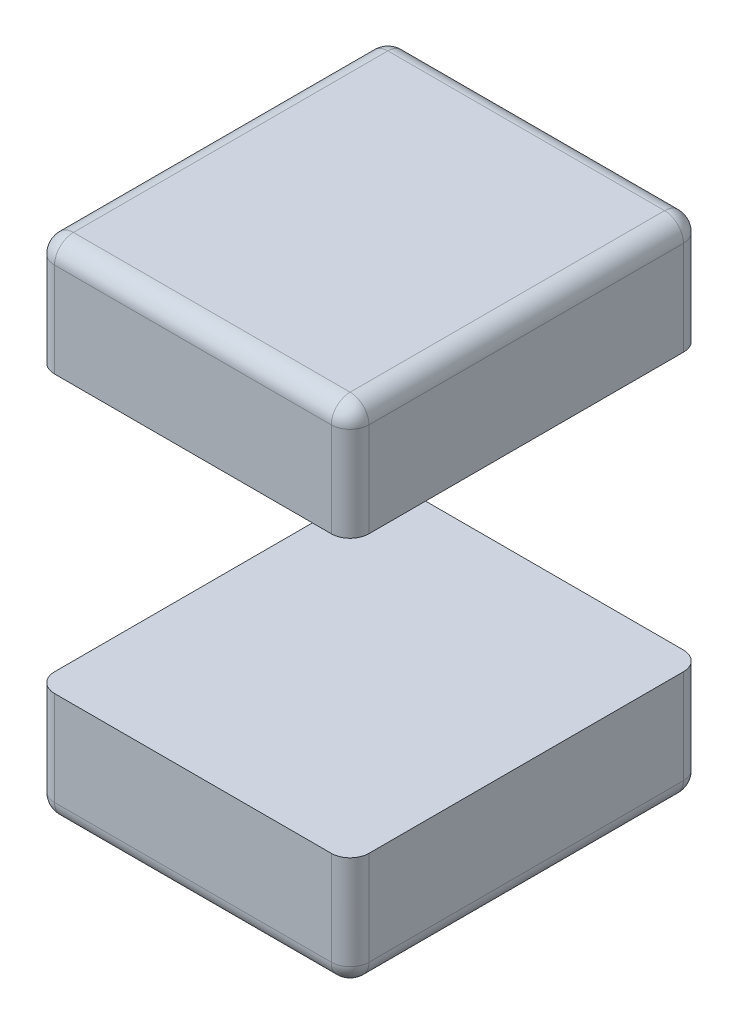
ISO-10303-21;
HEADER;
FILE_DESCRIPTION(('STEP AP214'),'2;1');
FILE_NAME('part.step','',(''),(''),'','','');
FILE_SCHEMA(('AUTOMOTIVE_DESIGN { 1 0 10303 214 1 1 1 1 }'));
ENDSEC;
DATA;
#1=APPLICATION_CONTEXT('core data for automotive mechanical design processes');
#2=APPLICATION_PROTOCOL_DEFINITION('international standard','automotive_design',2000,#1);
#3=PRODUCT_CONTEXT('',#1,'mechanical');
#4=PRODUCT('Part','Part','',(#3));
#5=PRODUCT_RELATED_PRODUCT_CATEGORY('part','',(#4));
#6=PRODUCT_DEFINITION_FORMATION('','',#4);
#7=PRODUCT_DEFINITION_CONTEXT('part definition',#1,'design');
#8=PRODUCT_DEFINITION('design','',#6,#7);
#9=PRODUCT_DEFINITION_SHAPE('','',#8);
#10=(LENGTH_UNIT() NAMED_UNIT(*) SI_UNIT(.MILLI.,.METRE.));
#11=(NAMED_UNIT(*) PLANE_ANGLE_UNIT() SI_UNIT($,.RADIAN.));
#12=(NAMED_UNIT(*) SI_UNIT($,.STERADIAN.) SOLID_ANGLE_UNIT());
#13=UNCERTAINTY_MEASURE_WITH_UNIT(LENGTH_MEASURE(1.E-05),#10,'distance_accuracy_value','');
#14=(GEOMETRIC_REPRESENTATION_CONTEXT(3) GLOBAL_UNCERTAINTY_ASSIGNED_CONTEXT((#13)) GLOBAL_UNIT_ASSIGNED_CONTEXT((#10,
#11,#12)) REPRESENTATION_CONTEXT('',''));
#15=CARTESIAN_POINT('',(0.,0.,0.));
#16=DIRECTION('',(0.,0.,1.));
#17=DIRECTION('',(1.,0.,0.));
#18=AXIS2_PLACEMENT_3D('',#15,#16,#17);
#19=CARTESIAN_POINT('',(-1.375000616289,-7.50000063268,-1.611601980525));
#20=DIRECTION('',(4.37113883977598E-08,0.999999999999995,8.74227765734796E-08));
#21=DIRECTION('',(0.,-8.74227765734797E-08,0.999999999999996));
#22=AXIS2_PLACEMENT_3D('',#19,#20,#21);
#23=PLANE('',#22);
#24=DIRECTION('',(0.999999999999999,-4.371138839776E-08,0.));
#25=VECTOR('',#24,1.);
#26=CARTESIAN_POINT('',(-1.06250061628865,-7.500000639783,-1.686601987081));
#27=LINE('',#26,#25);
#28=CARTESIAN_POINT('',(-0.200000617927823,-7.50000067748424,-1.68660198380265));
#29=VERTEX_POINT('',#28);
#30=CARTESIAN_POINT('',(-1.30000061792782,-7.50000062940173,-1.68660198380265));
#31=VERTEX_POINT('',#30);
#32=EDGE_CURVE('P0_E112',#29,#31,#27,.F.);
#33=ORIENTED_EDGE('',*,*,#32,.F.);
#34=DIRECTION('',(0.,8.74227765734797E-08,-0.999999999999996));
#35=VECTOR('',#34,1.);
#36=CARTESIAN_POINT('',(-0.200000619567,-7.500000684041,-1.61160198052429));
#37=LINE('',#36,#35);
#38=CARTESIAN_POINT('',(-0.200000617927823,-7.50000056820601,-2.93660198380265));
#39=VERTEX_POINT('',#38);
#40=EDGE_CURVE('P0_E177',#39,#29,#37,.F.);
#41=ORIENTED_EDGE('',*,*,#40,.F.);
#42=DIRECTION('',(0.999999999999999,-4.371138839776E-08,0.));
#43=VECTOR('',#42,1.);
#44=CARTESIAN_POINT('',(-1.06250061628865,-7.500000530505,-2.936601987081));
#45=LINE('',#44,#43);
#46=CARTESIAN_POINT('',(-1.30000061792782,-7.50000052012375,-2.93660198380265));
#47=VERTEX_POINT('',#46);
#48=EDGE_CURVE('P0_E181',#47,#39,#45,.T.);
#49=ORIENTED_EDGE('',*,*,#48,.F.);
#50=DIRECTION('',(0.,8.74227765734797E-08,-0.999999999999996));
#51=VECTOR('',#50,1.);
#52=CARTESIAN_POINT('',(-1.300000619567,-7.500000635959,-1.61160198052429));
#53=LINE('',#52,#51);
#54=EDGE_CURVE('P0_E104',#31,#47,#53,.T.);
#55=ORIENTED_EDGE('',*,*,#54,.F.);
#56=EDGE_LOOP('',(#33,#41,#49,#55));
#57=FACE_BOUND('',#56,.T.);
#58=ADVANCED_FACE('P0_F17',(#57),#23,.T.);
#59=CARTESIAN_POINT('',(-1.300000619567,-7.575000629402,-1.686601987081));
#60=DIRECTION('',(-0.577350243953183,0.577350243952509,0.577350319663183));
#61=DIRECTION('',(0.707106781186289,-9.27259486971366E-08,0.7071067811868));
#62=AXIS2_PLACEMENT_3D('',#59,#60,#61);
#63=SPHERICAL_SURFACE('',#62,0.075);
#64=CARTESIAN_POINT('',(-1.34330188786349,-7.53169936110556,-1.64330071310626));
#65=VERTEX_POINT('',#64);
#66=VERTEX_LOOP('',#65);
#67=FACE_BOUND('',#66,.T.);
#68=CARTESIAN_POINT('',(-1.30000061956727,-7.57500062940229,-1.68660198708154));
#69=DIRECTION('',(4.37113883561298E-08,0.999999999999995,8.74227765734796E-08));
#70=DIRECTION('',(0.,-8.74227765734797E-08,0.999999999999996));
#71=AXIS2_PLACEMENT_3D('',#68,#69,#70);
#72=CIRCLE('',#71,0.075);
#73=CARTESIAN_POINT('',(-1.30000062776314,-7.575000635959,-1.61160198708124));
#74=VERTEX_POINT('',#73);
#75=CARTESIAN_POINT('',(-1.37500061956692,-7.57500062612397,-1.686602003473));
#76=VERTEX_POINT('',#75);
#77=EDGE_CURVE('P0_E98',#74,#76,#72,.F.);
#78=ORIENTED_EDGE('',*,*,#77,.F.);
#79=CARTESIAN_POINT('',(-1.30000061956735,-7.57500062940155,-1.686601987081));
#80=DIRECTION('',(0.999999999999999,-4.371138839776E-08,0.));
#81=DIRECTION('',(4.371138839776E-08,0.999999999999999,0.));
#82=AXIS2_PLACEMENT_3D('',#79,#80,#81);
#83=CIRCLE('',#82,0.075);
#84=EDGE_CURVE('P0_E101',#31,#74,#83,.T.);
#85=ORIENTED_EDGE('',*,*,#84,.F.);
#86=CARTESIAN_POINT('',(-1.300000619567,-7.57500062940229,-1.686601987081));
#87=DIRECTION('',(0.,8.74227765734797E-08,-0.999999999999996));
#88=DIRECTION('',(0.,0.999999999999996,8.74227765734797E-08));
#89=AXIS2_PLACEMENT_3D('',#86,#87,#88);
#90=CIRCLE('',#89,0.075);
#91=EDGE_CURVE('P0_E20',#76,#31,#90,.T.);
#92=ORIENTED_EDGE('',*,*,#91,.F.);
#93=EDGE_LOOP('',(#78,#85,#92));
#94=FACE_BOUND('',#93,.T.);
#95=ADVANCED_FACE('P0_F97',(#67,#94),#63,.T.);
#96=CARTESIAN_POINT('',(-1.300000619567,-7.575000635959,-1.611601987081));
#97=DIRECTION('',(0.,8.74227765734797E-08,-0.999999999999996));
#98=DIRECTION('',(0.,0.999999999999996,8.74227765734797E-08));
#99=AXIS2_PLACEMENT_3D('',#96,#97,#98);
#100=CYLINDRICAL_SURFACE('',#99,0.075);
#101=CARTESIAN_POINT('',(-1.300000619567,-7.57500052012382,-2.93660198708171));
#102=DIRECTION('',(0.,8.74227765734797E-08,-0.999999999999996));
#103=DIRECTION('',(0.,0.999999999999996,8.74227765734797E-08));
#104=AXIS2_PLACEMENT_3D('',#101,#102,#103);
#105=CIRCLE('',#104,0.075);
#106=CARTESIAN_POINT('',(-1.37500061956686,-7.5750005714845,-2.93660198708135));
#107=VERTEX_POINT('',#106);
#108=EDGE_CURVE('P0_E118',#107,#47,#105,.T.);
#109=ORIENTED_EDGE('',*,*,#108,.F.);
#110=DIRECTION('',(0.,0.,1.));
#111=VECTOR('',#110,1.);
#112=CARTESIAN_POINT('',(-1.37500061956658,-7.575000626124,-1.61160215537));
#113=LINE('',#112,#111);
#114=EDGE_CURVE('P0_E115',#76,#107,#113,.F.);
#115=ORIENTED_EDGE('',*,*,#114,.F.);
#116=ORIENTED_EDGE('',*,*,#91,.T.);
#117=ORIENTED_EDGE('',*,*,#54,.T.);
#118=EDGE_LOOP('',(#109,#115,#116,#117));
#119=FACE_BOUND('',#118,.T.);
#120=ADVANCED_FACE('P0_F116',(#119),#100,.T.);
#121=CARTESIAN_POINT('',(-1.300000619567,-7.575000520124,-2.936601987081));
#122=DIRECTION('',(-0.577350243952926,0.577350344900017,-0.577350218715926));
#123=DIRECTION('',(-0.707106781186403,-3.09085932403974E-08,0.707106781186692));
#124=AXIS2_PLACEMENT_3D('',#121,#122,#123);
#125=SPHERICAL_SURFACE('',#124,0.075);
#126=CARTESIAN_POINT('',(-1.34330188786347,-7.5316992442565,-2.97990325348469));
#127=VERTEX_POINT('',#126);
#128=VERTEX_LOOP('',#127);
#129=FACE_BOUND('',#128,.T.);
#130=CARTESIAN_POINT('',(-1.30000061956727,-7.57500052012335,-2.93660198708154));
#131=DIRECTION('',(4.37113883561298E-08,0.999999999999995,8.74227765734796E-08));
#132=DIRECTION('',(0.,-8.74227765734797E-08,0.999999999999996));
#133=AXIS2_PLACEMENT_3D('',#130,#131,#132);
#134=CIRCLE('',#133,0.075);
#135=CARTESIAN_POINT('',(-1.300000627763,-7.57500051356682,-3.01160198708124));
#136=VERTEX_POINT('',#135);
#137=EDGE_CURVE('P0_E205',#107,#136,#134,.F.);
#138=ORIENTED_EDGE('',*,*,#137,.F.);
#139=ORIENTED_EDGE('',*,*,#108,.T.);
#140=CARTESIAN_POINT('',(-1.300000619567,-7.57500052012355,-2.936601987081));
#141=DIRECTION('',(0.999999999999999,-4.371138839776E-08,0.));
#142=DIRECTION('',(4.371138839776E-08,0.999999999999999,0.));
#143=AXIS2_PLACEMENT_3D('',#140,#141,#142);
#144=CIRCLE('',#143,0.075);
#145=EDGE_CURVE('P0_E184',#136,#47,#144,.T.);
#146=ORIENTED_EDGE('',*,*,#145,.F.);
#147=EDGE_LOOP('',(#138,#139,#146));
#148=FACE_BOUND('',#147,.T.);
#149=ADVANCED_FACE('P0_F165',(#129,#148),#125,.T.);
#150=CARTESIAN_POINT('',(-1.062500619567,-7.575000530505,-2.936601987081));
#151=DIRECTION('',(0.999999999999999,-4.371138839776E-08,0.));
#152=DIRECTION('',(4.371138839776E-08,0.999999999999999,0.));
#153=AXIS2_PLACEMENT_3D('',#150,#151,#152);
#154=CYLINDRICAL_SURFACE('',#153,0.075);
#155=CARTESIAN_POINT('',(-0.200000619567354,-7.57500056820607,-2.936601987081));
#156=DIRECTION('',(0.999999999999999,-4.371138839776E-08,0.));
#157=DIRECTION('',(4.371138839776E-08,0.999999999999999,0.));
#158=AXIS2_PLACEMENT_3D('',#155,#156,#157);
#159=CIRCLE('',#158,0.075);
#160=CARTESIAN_POINT('',(-0.200000619567006,-7.57500053760818,-3.01160198708122));
#161=VERTEX_POINT('',#160);
#162=EDGE_CURVE('P0_E183',#161,#39,#159,.T.);
#163=ORIENTED_EDGE('',*,*,#162,.F.);
#164=DIRECTION('',(1.,0.,0.));
#165=VECTOR('',#164,1.);
#166=CARTESIAN_POINT('',(-0.75000066,-7.575000513567,-3.01160198708093));
#167=LINE('',#166,#165);
#168=EDGE_CURVE('P0_E158',#136,#161,#167,.T.);
#169=ORIENTED_EDGE('',*,*,#168,.F.);
#170=ORIENTED_EDGE('',*,*,#145,.T.);
#171=ORIENTED_EDGE('',*,*,#48,.T.);
#172=EDGE_LOOP('',(#163,#169,#170,#171));
#173=FACE_BOUND('',#172,.T.);
#174=ADVANCED_FACE('P0_F153',(#173),#154,.T.);
#175=CARTESIAN_POINT('',(-0.200000619567,-7.575000568206,-2.936601987081));
#176=DIRECTION('',(0.577350294426501,0.577350294426501,-0.577350218715871));
#177=DIRECTION('',(-0.707106750277813,0.707106812095278,6.181747339018E-08));
#178=AXIS2_PLACEMENT_3D('',#175,#176,#177);
#179=SPHERICAL_SURFACE('',#178,0.075);
#180=CARTESIAN_POINT('',(-0.156699347485013,-7.53169929612401,-2.97990325348469));
#181=VERTEX_POINT('',#180);
#182=VERTEX_LOOP('',#181);
#183=FACE_BOUND('',#182,.T.);
#184=CARTESIAN_POINT('',(-0.20000061956666,-7.57500056820571,-2.93660198708132));
#185=DIRECTION('',(-4.37113885642898E-08,-0.999999999999995,-8.74227765734796E-08));
#186=DIRECTION('',(0.,8.74227765734797E-08,-0.999999999999996));
#187=AXIS2_PLACEMENT_3D('',#184,#185,#186);
#188=CIRCLE('',#187,0.075);
#189=CARTESIAN_POINT('',(-0.125000619567007,-7.57500057148403,-2.936602003473));
#190=VERTEX_POINT('',#189);
#191=EDGE_CURVE('P0_E201',#161,#190,#188,.T.);
#192=ORIENTED_EDGE('',*,*,#191,.F.);
#193=ORIENTED_EDGE('',*,*,#162,.T.);
#194=CARTESIAN_POINT('',(-0.200000619567,-7.57500056820582,-2.936601987081));
#195=DIRECTION('',(0.,8.74227765734797E-08,-0.999999999999996));
#196=DIRECTION('',(0.,0.999999999999996,8.74227765734797E-08));
#197=AXIS2_PLACEMENT_3D('',#194,#195,#196);
#198=CIRCLE('',#197,0.075);
#199=EDGE_CURVE('P0_E180',#190,#39,#198,.F.);
#200=ORIENTED_EDGE('',*,*,#199,.F.);
#201=EDGE_LOOP('',(#192,#193,#200));
#202=FACE_BOUND('',#201,.T.);
#203=ADVANCED_FACE('P0_F149',(#183,#202),#179,.T.);
#204=CARTESIAN_POINT('',(-0.200000619567,-7.575000684041,-1.611601987081));
#205=DIRECTION('',(0.,8.74227765734797E-08,-0.999999999999996));
#206=DIRECTION('',(0.,0.999999999999996,8.74227765734797E-08));
#207=AXIS2_PLACEMENT_3D('',#204,#205,#206);
#208=CYLINDRICAL_SURFACE('',#207,0.075);
#209=ORIENTED_EDGE('',*,*,#199,.T.);
#210=ORIENTED_EDGE('',*,*,#40,.T.);
#211=CARTESIAN_POINT('',(-0.200000619567,-7.57500067748429,-1.68660198708171));
#212=DIRECTION('',(0.,8.74227765734797E-08,-0.999999999999996));
#213=DIRECTION('',(0.,0.999999999999996,8.74227765734797E-08));
#214=AXIS2_PLACEMENT_3D('',#211,#212,#213);
#215=CIRCLE('',#214,0.075);
#216=CARTESIAN_POINT('',(-0.12500061956709,-7.5750006261235,-1.68660198708135));
#217=VERTEX_POINT('',#216);
#218=EDGE_CURVE('P0_E179',#217,#29,#215,.F.);
#219=ORIENTED_EDGE('',*,*,#218,.F.);
#220=DIRECTION('',(0.,0.,1.));
#221=VECTOR('',#220,1.);
#222=CARTESIAN_POINT('',(-0.125000619567349,-7.575000571484,-1.611601980525));
#223=LINE('',#222,#221);
#224=EDGE_CURVE('P0_E136',#190,#217,#223,.T.);
#225=ORIENTED_EDGE('',*,*,#224,.F.);
#226=EDGE_LOOP('',(#209,#210,#219,#225));
#227=FACE_BOUND('',#226,.T.);
#228=ADVANCED_FACE('P0_F144',(#227),#208,.T.);
#229=CARTESIAN_POINT('',(-0.200000619567,-7.575000677485,-1.686601987081));
#230=DIRECTION('',(0.577350294426266,0.577350193479302,0.577350319663302));
#231=DIRECTION('',(-3.09087739291947E-08,-0.707106843003762,0.707106719369327));
#232=AXIS2_PLACEMENT_3D('',#229,#230,#231);
#233=SPHERICAL_SURFACE('',#232,0.075);
#234=CARTESIAN_POINT('',(-0.15669934748503,-7.53169941297405,-1.64330071310625));
#235=VERTEX_POINT('',#234);
#236=VERTEX_LOOP('',#235);
#237=FACE_BOUND('',#236,.T.);
#238=CARTESIAN_POINT('',(-0.20000061956666,-7.57500067748465,-1.68660198708132));
#239=DIRECTION('',(-4.37113885642898E-08,-0.999999999999995,-8.74227765734796E-08));
#240=DIRECTION('',(0.,8.74227765734797E-08,-0.999999999999996));
#241=AXIS2_PLACEMENT_3D('',#238,#239,#240);
#242=CIRCLE('',#241,0.075);
#243=CARTESIAN_POINT('',(-0.200000619567,-7.57500066000026,-1.61160198708097));
#244=VERTEX_POINT('',#243);
#245=EDGE_CURVE('P0_E198',#217,#244,#242,.T.);
#246=ORIENTED_EDGE('',*,*,#245,.F.);
#247=ORIENTED_EDGE('',*,*,#218,.T.);
#248=CARTESIAN_POINT('',(-0.200000619567,-7.57500067748407,-1.686601987081));
#249=DIRECTION('',(0.999999999999999,-4.371138839776E-08,0.));
#250=DIRECTION('',(4.371138839776E-08,0.999999999999999,0.));
#251=AXIS2_PLACEMENT_3D('',#248,#249,#250);
#252=CIRCLE('',#251,0.075);
#253=EDGE_CURVE('P0_E176',#244,#29,#252,.F.);
#254=ORIENTED_EDGE('',*,*,#253,.F.);
#255=EDGE_LOOP('',(#246,#247,#254));
#256=FACE_BOUND('',#255,.T.);
#257=ADVANCED_FACE('P0_F139',(#237,#256),#233,.T.);
#258=CARTESIAN_POINT('',(-1.062500619567,-7.575000639783,-1.686601987081));
#259=DIRECTION('',(0.999999999999999,-4.371138839776E-08,0.));
#260=DIRECTION('',(4.371138839776E-08,0.999999999999999,0.));
#261=AXIS2_PLACEMENT_3D('',#258,#259,#260);
#262=CYLINDRICAL_SURFACE('',#261,0.075);
#263=ORIENTED_EDGE('',*,*,#253,.T.);
#264=ORIENTED_EDGE('',*,*,#32,.T.);
#265=ORIENTED_EDGE('',*,*,#84,.T.);
#266=DIRECTION('',(1.,0.,0.));
#267=VECTOR('',#266,1.);
#268=CARTESIAN_POINT('',(-0.75000066,-7.575000635959,-1.61160198708093));
#269=LINE('',#268,#267);
#270=EDGE_CURVE('P0_E131',#74,#244,#269,.T.);
#271=ORIENTED_EDGE('',*,*,#270,.T.);
#272=EDGE_LOOP('',(#263,#264,#265,#271));
#273=FACE_BOUND('',#272,.T.);
#274=ADVANCED_FACE('P0_F143',(#273),#262,.T.);
#275=CARTESIAN_POINT('',(-1.300000681856,-9.000000629402,-1.686602111659));
#276=DIRECTION('',(4.37113883561298E-08,0.999999999999995,8.74227765734796E-08));
#277=DIRECTION('',(0.,-8.74227765734797E-08,0.999999999999996));
#278=AXIS2_PLACEMENT_3D('',#275,#276,#277);
#279=CYLINDRICAL_SURFACE('',#278,0.075);
#280=ORIENTED_EDGE('',*,*,#77,.T.);
#281=DIRECTION('',(-4.371138835613E-08,-0.999999999999999,0.));
#282=VECTOR('',#281,1.);
#283=CARTESIAN_POINT('',(-1.375000703711,-9.50000063268,-1.686602019865));
#284=LINE('',#283,#282);
#285=CARTESIAN_POINT('',(-1.37500063595867,-7.950000626124,-1.68660201986504));
#286=VERTEX_POINT('',#285);
#287=EDGE_CURVE('P0_E108',#286,#76,#284,.F.);
#288=ORIENTED_EDGE('',*,*,#287,.F.);
#289=CARTESIAN_POINT('',(-1.30000063595904,-7.95000062940236,-1.68660201986508));
#290=DIRECTION('',(4.37113883561298E-08,0.999999999999995,8.74227765734796E-08));
#291=DIRECTION('',(0.,-8.74227765734797E-08,0.999999999999996));
#292=AXIS2_PLACEMENT_3D('',#289,#290,#291);
#293=CIRCLE('',#292,0.075);
#294=CARTESIAN_POINT('',(-1.30000063595902,-7.9500006359589,-1.61160201986491));
#295=VERTEX_POINT('',#294);
#296=EDGE_CURVE('P0_E196',#295,#286,#293,.F.);
#297=ORIENTED_EDGE('',*,*,#296,.F.);
#298=DIRECTION('',(0.,0.999999999999996,8.74227765734797E-08));
#299=VECTOR('',#298,1.);
#300=CARTESIAN_POINT('',(-1.300000635959,-8.50000066,-1.611602067947));
#301=LINE('',#300,#299);
#302=EDGE_CURVE('P0_E111',#295,#74,#301,.T.);
#303=ORIENTED_EDGE('',*,*,#302,.T.);
#304=EDGE_LOOP('',(#280,#288,#297,#303));
#305=FACE_BOUND('',#304,.T.);
#306=ADVANCED_FACE('P0_F106',(#305),#279,.T.);
#307=CARTESIAN_POINT('',(-1.375000703711,-9.50000063268,-1.61160215537));
#308=DIRECTION('',(-0.999999999999999,4.371138835613E-08,0.));
#309=DIRECTION('',(-4.371138835613E-08,-0.999999999999999,0.));
#310=AXIS2_PLACEMENT_3D('',#307,#308,#309);
#311=PLANE('',#310);
#312=ORIENTED_EDGE('',*,*,#114,.T.);
#313=DIRECTION('',(4.37113883561298E-08,0.999999999999995,8.74227765734796E-08));
#314=VECTOR('',#313,1.);
#315=CARTESIAN_POINT('',(-1.375000681856,-9.00000051684565,-2.93660211165892));
#316=LINE('',#315,#314);
#317=CARTESIAN_POINT('',(-1.37500063595901,-7.95000051684528,-2.93660201986504));
#318=VERTEX_POINT('',#317);
#319=EDGE_CURVE('P0_E121',#318,#107,#316,.T.);
#320=ORIENTED_EDGE('',*,*,#319,.F.);
#321=DIRECTION('',(0.,8.74227765734797E-08,-0.999999999999996));
#322=VECTOR('',#321,1.);
#323=CARTESIAN_POINT('',(-1.375000635959,-7.95000051028849,-3.01160201986499));
#324=LINE('',#323,#322);
#325=EDGE_CURVE('P0_E125',#286,#318,#324,.T.);
#326=ORIENTED_EDGE('',*,*,#325,.F.);
#327=ORIENTED_EDGE('',*,*,#287,.T.);
#328=EDGE_LOOP('',(#312,#320,#326,#327));
#329=FACE_BOUND('',#328,.T.);
#330=ADVANCED_FACE('P0_F123',(#329),#311,.T.);
#331=CARTESIAN_POINT('',(-1.300000681856,-9.000000520124,-2.936602111659));
#332=DIRECTION('',(4.37113883561298E-08,0.999999999999995,8.74227765734796E-08));
#333=DIRECTION('',(0.,-8.74227765734797E-08,0.999999999999996));
#334=AXIS2_PLACEMENT_3D('',#331,#332,#333);
#335=CYLINDRICAL_SURFACE('',#334,0.075);
#336=ORIENTED_EDGE('',*,*,#137,.T.);
#337=DIRECTION('',(0.,0.999999999999996,8.74227765734797E-08));
#338=VECTOR('',#337,1.);
#339=CARTESIAN_POINT('',(-1.300000635959,-8.500000537608,-3.011602067947));
#340=LINE('',#339,#338);
#341=CARTESIAN_POINT('',(-1.30000063595902,-7.950000513567,-3.01160201986474));
#342=VERTEX_POINT('',#341);
#343=EDGE_CURVE('P0_E162',#342,#136,#340,.T.);
#344=ORIENTED_EDGE('',*,*,#343,.F.);
#345=CARTESIAN_POINT('',(-1.30000063595904,-7.95000052012371,-2.93660201986508));
#346=DIRECTION('',(4.37113883561298E-08,0.999999999999995,8.74227765734796E-08));
#347=DIRECTION('',(0.,-8.74227765734797E-08,0.999999999999996));
#348=AXIS2_PLACEMENT_3D('',#345,#346,#347);
#349=CIRCLE('',#348,0.075);
#350=EDGE_CURVE('P0_E193',#318,#342,#349,.F.);
#351=ORIENTED_EDGE('',*,*,#350,.F.);
#352=ORIENTED_EDGE('',*,*,#319,.T.);
#353=EDGE_LOOP('',(#336,#344,#351,#352));
#354=FACE_BOUND('',#353,.T.);
#355=ADVANCED_FACE('P0_F310',(#354),#335,.T.);
#356=CARTESIAN_POINT('',(-0.75000066,-8.500000537608,-3.011602067947));
#357=DIRECTION('',(0.,8.74227765734797E-08,-0.999999999999996));
#358=DIRECTION('',(0.,0.999999999999996,8.74227765734797E-08));
#359=AXIS2_PLACEMENT_3D('',#356,#357,#358);
#360=PLANE('',#359);
#361=ORIENTED_EDGE('',*,*,#168,.T.);
#362=DIRECTION('',(-4.37113885642898E-08,-0.999999999999995,-8.74227765734796E-08));
#363=VECTOR('',#362,1.);
#364=CARTESIAN_POINT('',(-0.200000638144,-8.00000056164929,-3.011602024236));
#365=LINE('',#364,#363);
#366=CARTESIAN_POINT('',(-0.200000635958431,-7.95000056164915,-3.01160201986497));
#367=VERTEX_POINT('',#366);
#368=EDGE_CURVE('P0_E161',#367,#161,#365,.F.);
#369=ORIENTED_EDGE('',*,*,#368,.F.);
#370=DIRECTION('',(0.999999999999999,-4.37113882867396E-08,0.));
#371=VECTOR('',#370,1.);
#372=CARTESIAN_POINT('',(0.09330122893321,-7.95000057447,-3.01160201986501));
#373=LINE('',#372,#371);
#374=EDGE_CURVE('P0_E192',#342,#367,#373,.T.);
#375=ORIENTED_EDGE('',*,*,#374,.F.);
#376=ORIENTED_EDGE('',*,*,#343,.T.);
#377=EDGE_LOOP('',(#361,#369,#375,#376));
#378=FACE_BOUND('',#377,.T.);
#379=ADVANCED_FACE('P0_F231',(#378),#360,.T.);
#380=CARTESIAN_POINT('',(-0.200000638144,-8.000000568206,-2.936602024236));
#381=DIRECTION('',(-4.37113885642898E-08,-0.999999999999995,-8.74227765734796E-08));
#382=DIRECTION('',(0.,8.74227765734797E-08,-0.999999999999996));
#383=AXIS2_PLACEMENT_3D('',#380,#381,#382);
#384=CYLINDRICAL_SURFACE('',#383,0.075);
#385=ORIENTED_EDGE('',*,*,#191,.T.);
#386=DIRECTION('',(4.371138856429E-08,0.999999999999999,0.));
#387=VECTOR('',#386,1.);
#388=CARTESIAN_POINT('',(-0.125000616289005,-7.50000068732,-2.936602019865));
#389=LINE('',#388,#387);
#390=CARTESIAN_POINT('',(-0.125000635959031,-7.95000057148421,-2.93660201986493));
#391=VERTEX_POINT('',#390);
#392=EDGE_CURVE('P0_E204',#391,#190,#389,.T.);
#393=ORIENTED_EDGE('',*,*,#392,.F.);
#394=CARTESIAN_POINT('',(-0.200000635958431,-7.95000056820564,-2.93660201986486));
#395=DIRECTION('',(-4.37113885642898E-08,-0.999999999999995,-8.74227765734796E-08));
#396=DIRECTION('',(0.,8.74227765734797E-08,-0.999999999999996));
#397=AXIS2_PLACEMENT_3D('',#394,#395,#396);
#398=CIRCLE('',#397,0.075);
#399=EDGE_CURVE('P0_E189',#367,#391,#398,.T.);
#400=ORIENTED_EDGE('',*,*,#399,.F.);
#401=ORIENTED_EDGE('',*,*,#368,.T.);
#402=EDGE_LOOP('',(#385,#393,#400,#401));
#403=FACE_BOUND('',#402,.T.);
#404=ADVANCED_FACE('P0_F267',(#403),#384,.T.);
#405=CARTESIAN_POINT('',(-0.125000616289,-7.50000068732,-1.611601980525));
#406=DIRECTION('',(0.999999999999999,-4.371138856429E-08,0.));
#407=DIRECTION('',(4.371138856429E-08,0.999999999999999,0.));
#408=AXIS2_PLACEMENT_3D('',#405,#406,#407);
#409=PLANE('',#408);
#410=ORIENTED_EDGE('',*,*,#224,.T.);
#411=DIRECTION('',(-4.37113885642898E-08,-0.999999999999995,-8.74227765734796E-08));
#412=VECTOR('',#411,1.);
#413=CARTESIAN_POINT('',(-0.125000638144,-8.00000068076335,-1.68660202423614));
#414=LINE('',#413,#412);
#415=CARTESIAN_POINT('',(-0.125000635958715,-7.95000068076264,-1.68660201986493));
#416=VERTEX_POINT('',#415);
#417=EDGE_CURVE('P0_E200',#416,#217,#414,.F.);
#418=ORIENTED_EDGE('',*,*,#417,.F.);
#419=DIRECTION('',(0.,8.74227765734797E-08,-0.999999999999996));
#420=VECTOR('',#419,1.);
#421=CARTESIAN_POINT('',(-0.125000635959,-7.95000056492772,-3.011602019865));
#422=LINE('',#421,#420);
#423=EDGE_CURVE('P0_E188',#391,#416,#422,.F.);
#424=ORIENTED_EDGE('',*,*,#423,.F.);
#425=ORIENTED_EDGE('',*,*,#392,.T.);
#426=EDGE_LOOP('',(#410,#418,#424,#425));
#427=FACE_BOUND('',#426,.T.);
#428=ADVANCED_FACE('P0_F253',(#427),#409,.T.);
#429=CARTESIAN_POINT('',(-0.200000638144,-8.000000677485,-1.686602024236));
#430=DIRECTION('',(-4.37113885642898E-08,-0.999999999999995,-8.74227765734796E-08));
#431=DIRECTION('',(0.,8.74227765734797E-08,-0.999999999999996));
#432=AXIS2_PLACEMENT_3D('',#429,#430,#431);
#433=CYLINDRICAL_SURFACE('',#432,0.075);
#434=ORIENTED_EDGE('',*,*,#245,.T.);
#435=DIRECTION('',(0.,0.999999999999996,8.74227765734797E-08));
#436=VECTOR('',#435,1.);
#437=CARTESIAN_POINT('',(-0.200000619567,-8.50000066,-1.611602067947));
#438=LINE('',#437,#436);
#439=CARTESIAN_POINT('',(-0.200000627762715,-7.950000684041,-1.61160201986474));
#440=VERTEX_POINT('',#439);
#441=EDGE_CURVE('P0_E35',#244,#440,#438,.F.);
#442=ORIENTED_EDGE('',*,*,#441,.T.);
#443=CARTESIAN_POINT('',(-0.200000635958431,-7.95000067748429,-1.68660201986486));
#444=DIRECTION('',(-4.37113885642898E-08,-0.999999999999995,-8.74227765734796E-08));
#445=DIRECTION('',(0.,8.74227765734797E-08,-0.999999999999996));
#446=AXIS2_PLACEMENT_3D('',#443,#444,#445);
#447=CIRCLE('',#446,0.075);
#448=EDGE_CURVE('P0_E26',#416,#440,#447,.T.);
#449=ORIENTED_EDGE('',*,*,#448,.F.);
#450=ORIENTED_EDGE('',*,*,#417,.T.);
#451=EDGE_LOOP('',(#434,#442,#449,#450));
#452=FACE_BOUND('',#451,.T.);
#453=ADVANCED_FACE('P0_F256',(#452),#433,.T.);
#454=CARTESIAN_POINT('',(-0.75000066,-8.50000066,-1.611602067947));
#455=DIRECTION('',(0.,8.74227765734797E-08,-0.999999999999996));
#456=DIRECTION('',(0.,0.999999999999996,8.74227765734797E-08));
#457=AXIS2_PLACEMENT_3D('',#454,#455,#456);
#458=PLANE('',#457);
#459=ORIENTED_EDGE('',*,*,#441,.F.);
#460=ORIENTED_EDGE('',*,*,#270,.F.);
#461=ORIENTED_EDGE('',*,*,#302,.F.);
#462=DIRECTION('',(0.999999999999999,-4.37113882867396E-08,0.));
#463=VECTOR('',#462,1.);
#464=CARTESIAN_POINT('',(0.09330122893321,-7.95000069686189,-1.611602019865));
#465=LINE('',#464,#463);
#466=EDGE_CURVE('P0_E11',#440,#295,#465,.F.);
#467=ORIENTED_EDGE('',*,*,#466,.F.);
#468=EDGE_LOOP('',(#459,#460,#461,#467));
#469=FACE_BOUND('',#468,.T.);
#470=ADVANCED_FACE('P0_F258',(#469),#458,.F.);
#471=CARTESIAN_POINT('',(0.09330122893321,-7.95000057447,-3.011602019865));
#472=DIRECTION('',(-4.37113882867398E-08,-0.999999999999995,-8.74227765734796E-08));
#473=DIRECTION('',(0.,8.74227765734797E-08,-0.999999999999996));
#474=AXIS2_PLACEMENT_3D('',#471,#472,#473);
#475=PLANE('',#474);
#476=ORIENTED_EDGE('',*,*,#448,.T.);
#477=ORIENTED_EDGE('',*,*,#466,.T.);
#478=ORIENTED_EDGE('',*,*,#296,.T.);
#479=ORIENTED_EDGE('',*,*,#325,.T.);
#480=ORIENTED_EDGE('',*,*,#350,.T.);
#481=ORIENTED_EDGE('',*,*,#374,.T.);
#482=ORIENTED_EDGE('',*,*,#399,.T.);
#483=ORIENTED_EDGE('',*,*,#423,.T.);
#484=EDGE_LOOP('',(#476,#477,#478,#479,#480,#481,#482,#483));
#485=FACE_BOUND('',#484,.T.);
#486=ADVANCED_FACE('P0_F249',(#485),#475,.T.);
#487=CLOSED_SHELL('',(#58,#95,#120,#149,#174,#203,#228,#257,#274,#306,#330,#355,#379,#404,#428,
#453,#470,#486));
#488=MANIFOLD_SOLID_BREP('P0_B1',#487);
#489=CARTESIAN_POINT('',(-0.125000703711,-9.50000068732,-1.61160215537));
#490=DIRECTION('',(-4.37113885087798E-08,-0.999999999999995,-8.74227765734796E-08));
#491=DIRECTION('',(0.,8.74227765734797E-08,-0.999999999999996));
#492=AXIS2_PLACEMENT_3D('',#489,#490,#491);
#493=PLANE('',#492);
#494=DIRECTION('',(-0.999999999999999,4.371138850878E-08,0.));
#495=VECTOR('',#494,1.);
#496=CARTESIAN_POINT('',(-0.437500703711354,-9.500000667103,-1.686602148813));
#497=LINE('',#496,#495);
#498=CARTESIAN_POINT('',(-1.30000070371118,-9.50000062940202,-1.6866021520915));
#499=VERTEX_POINT('',#498);
#500=CARTESIAN_POINT('',(-0.200000703711,-9.50000067748437,-1.68660215209136));
#501=VERTEX_POINT('',#500);
#502=EDGE_CURVE('P1_E103',#499,#501,#497,.F.);
#503=ORIENTED_EDGE('',*,*,#502,.F.);
#504=DIRECTION('',(0.,8.74227765734797E-08,-0.999999999999996));
#505=VECTOR('',#504,1.);
#506=CARTESIAN_POINT('',(-1.300000703711,-9.500000635959,-1.61160215536971));
#507=LINE('',#506,#505);
#508=CARTESIAN_POINT('',(-1.30000070371118,-9.50000052012393,-2.93660215209135));
#509=VERTEX_POINT('',#508);
#510=EDGE_CURVE('P1_E121',#509,#499,#507,.F.);
#511=ORIENTED_EDGE('',*,*,#510,.F.);
#512=DIRECTION('',(-0.999999999999999,4.371138850878E-08,0.));
#513=VECTOR('',#512,1.);
#514=CARTESIAN_POINT('',(-0.437500703711354,-9.500000557825,-2.936602148813));
#515=LINE('',#514,#513);
#516=CARTESIAN_POINT('',(-0.200000703711177,-9.50000056820614,-2.9366021520915));
#517=VERTEX_POINT('',#516);
#518=EDGE_CURVE('P1_E179',#517,#509,#515,.T.);
#519=ORIENTED_EDGE('',*,*,#518,.F.);
#520=DIRECTION('',(0.,8.74227765734797E-08,-0.999999999999996));
#521=VECTOR('',#520,1.);
#522=CARTESIAN_POINT('',(-0.200000703711,-9.500000684041,-1.61160215536971));
#523=LINE('',#522,#521);
#524=EDGE_CURVE('P1_E183',#501,#517,#523,.T.);
#525=ORIENTED_EDGE('',*,*,#524,.F.);
#526=EDGE_LOOP('',(#503,#511,#519,#525));
#527=FACE_BOUND('',#526,.T.);
#528=ADVANCED_FACE('P1_F17',(#527),#493,.T.);
#529=CARTESIAN_POINT('',(-1.300000700433,-9.425000629402,-1.686602148813));
#530=DIRECTION('',(-0.577350294426306,-0.577350294426262,0.577350218716306));
#531=DIRECTION('',(0.707106781186515,-9.27253714089193E-08,0.707106781186574));
#532=AXIS2_PLACEMENT_3D('',#529,#530,#531);
#533=SPHERICAL_SURFACE('',#532,0.075);
#534=CARTESIAN_POINT('',(-1.34330197251497,-9.46830190148397,-1.64330088240928));
#535=VERTEX_POINT('',#534);
#536=VERTEX_LOOP('',#535);
#537=FACE_BOUND('',#536,.T.);
#538=CARTESIAN_POINT('',(-1.30000070043334,-9.42500062940236,-1.68660214881368));
#539=DIRECTION('',(4.37113883561298E-08,0.999999999999995,8.74227765734796E-08));
#540=DIRECTION('',(0.,-8.74227765734797E-08,0.999999999999996));
#541=AXIS2_PLACEMENT_3D('',#538,#539,#540);
#542=CIRCLE('',#541,0.075);
#543=CARTESIAN_POINT('',(-1.37500070043299,-9.4250005714845,-1.686602148813));
#544=VERTEX_POINT('',#543);
#545=CARTESIAN_POINT('',(-1.300000700433,-9.42500065999974,-1.61160214881303));
#546=VERTEX_POINT('',#545);
#547=EDGE_CURVE('P1_E99',#544,#546,#542,.T.);
#548=ORIENTED_EDGE('',*,*,#547,.F.);
#549=CARTESIAN_POINT('',(-1.300000700433,-9.42500062940229,-1.68660214881329));
#550=DIRECTION('',(0.,8.74227765734797E-08,-0.999999999999996));
#551=DIRECTION('',(0.,0.999999999999996,8.74227765734797E-08));
#552=AXIS2_PLACEMENT_3D('',#549,#550,#551);
#553=CIRCLE('',#552,0.075);
#554=EDGE_CURVE('P1_E101',#499,#544,#553,.T.);
#555=ORIENTED_EDGE('',*,*,#554,.F.);
#556=CARTESIAN_POINT('',(-1.300000700433,-9.42500062940193,-1.686602148813));
#557=DIRECTION('',(-0.999999999999999,4.371138850878E-08,0.));
#558=DIRECTION('',(-4.371138850878E-08,-0.999999999999999,0.));
#559=AXIS2_PLACEMENT_3D('',#556,#557,#558);
#560=CIRCLE('',#559,0.075);
#561=EDGE_CURVE('P1_E20',#546,#499,#560,.F.);
#562=ORIENTED_EDGE('',*,*,#561,.F.);
#563=EDGE_LOOP('',(#548,#555,#562));
#564=FACE_BOUND('',#563,.T.);
#565=ADVANCED_FACE('P1_F97',(#537,#564),#533,.T.);
#566=CARTESIAN_POINT('',(-0.437500700433,-9.425000667103,-1.686602148813));
#567=DIRECTION('',(-0.999999999999999,4.371138850878E-08,0.));
#568=DIRECTION('',(-4.371138850878E-08,-0.999999999999999,0.));
#569=AXIS2_PLACEMENT_3D('',#566,#567,#568);
#570=CYLINDRICAL_SURFACE('',#569,0.075);
#571=ORIENTED_EDGE('',*,*,#561,.T.);
#572=ORIENTED_EDGE('',*,*,#502,.T.);
#573=CARTESIAN_POINT('',(-0.200000700432646,-9.42500067748445,-1.686602148813));
#574=DIRECTION('',(-0.999999999999999,4.371138850878E-08,0.));
#575=DIRECTION('',(-4.371138850878E-08,-0.999999999999999,0.));
#576=AXIS2_PLACEMENT_3D('',#573,#574,#575);
#577=CIRCLE('',#576,0.075);
#578=CARTESIAN_POINT('',(-0.200000692236885,-9.425000684041,-1.61160214881317));
#579=VERTEX_POINT('',#578);
#580=EDGE_CURVE('P1_E108',#579,#501,#577,.F.);
#581=ORIENTED_EDGE('',*,*,#580,.F.);
#582=DIRECTION('',(1.,0.,0.));
#583=VECTOR('',#582,1.);
#584=CARTESIAN_POINT('',(-0.75000066,-9.425000684041,-1.61160214881307));
#585=LINE('',#584,#583);
#586=EDGE_CURVE('P1_E105',#579,#546,#585,.F.);
#587=ORIENTED_EDGE('',*,*,#586,.T.);
#588=EDGE_LOOP('',(#571,#572,#581,#587));
#589=FACE_BOUND('',#588,.T.);
#590=ADVANCED_FACE('P1_F106',(#589),#570,.T.);
#591=CARTESIAN_POINT('',(-0.200000700433,-9.425000677485,-1.686602148813));
#592=DIRECTION('',(0.577350243952765,-0.577350344899765,0.57735021871634));
#593=DIRECTION('',(0.707106812095173,0.707106750277918,6.18170686028652E-08));
#594=AXIS2_PLACEMENT_3D('',#591,#592,#593);
#595=SPHERICAL_SURFACE('',#594,0.075);
#596=CARTESIAN_POINT('',(-0.156699432136543,-9.46830195335248,-1.64330088240927));
#597=VERTEX_POINT('',#596);
#598=VERTEX_LOOP('',#597);
#599=FACE_BOUND('',#598,.T.);
#600=CARTESIAN_POINT('',(-0.200000700432729,-9.42500067748429,-1.68660214881346));
#601=DIRECTION('',(-4.37113885642898E-08,-0.999999999999995,-8.74227765734796E-08));
#602=DIRECTION('',(0.,8.74227765734797E-08,-0.999999999999996));
#603=AXIS2_PLACEMENT_3D('',#600,#601,#602);
#604=CIRCLE('',#603,0.075);
#605=CARTESIAN_POINT('',(-0.125000700433423,-9.42500068076282,-1.68660213242173));
#606=VERTEX_POINT('',#605);
#607=EDGE_CURVE('P1_E130',#579,#606,#604,.F.);
#608=ORIENTED_EDGE('',*,*,#607,.F.);
#609=ORIENTED_EDGE('',*,*,#580,.T.);
#610=CARTESIAN_POINT('',(-0.200000700433,-9.42500067748429,-1.686602148813));
#611=DIRECTION('',(0.,8.74227765734797E-08,-0.999999999999996));
#612=DIRECTION('',(0.,0.999999999999996,8.74227765734797E-08));
#613=AXIS2_PLACEMENT_3D('',#610,#611,#612);
#614=CIRCLE('',#613,0.075);
#615=EDGE_CURVE('P1_E186',#606,#501,#614,.T.);
#616=ORIENTED_EDGE('',*,*,#615,.F.);
#617=EDGE_LOOP('',(#608,#609,#616));
#618=FACE_BOUND('',#617,.T.);
#619=ADVANCED_FACE('P1_F167',(#599,#618),#595,.T.);
#620=CARTESIAN_POINT('',(-0.200000700433,-9.425000684041,-1.611602148813));
#621=DIRECTION('',(0.,8.74227765734797E-08,-0.999999999999996));
#622=DIRECTION('',(0.,0.999999999999996,8.74227765734797E-08));
#623=AXIS2_PLACEMENT_3D('',#620,#621,#622);
#624=CYLINDRICAL_SURFACE('',#623,0.075);
#625=CARTESIAN_POINT('',(-0.200000700433,-9.42500056820582,-2.93660214881329));
#626=DIRECTION('',(0.,8.74227765734797E-08,-0.999999999999996));
#627=DIRECTION('',(0.,0.999999999999996,8.74227765734797E-08));
#628=AXIS2_PLACEMENT_3D('',#625,#626,#627);
#629=CIRCLE('',#628,0.075);
#630=CARTESIAN_POINT('',(-0.125000700433146,-9.4250006261235,-2.93660214881315));
#631=VERTEX_POINT('',#630);
#632=EDGE_CURVE('P1_E185',#631,#517,#629,.T.);
#633=ORIENTED_EDGE('',*,*,#632,.F.);
#634=DIRECTION('',(0.,0.,1.));
#635=VECTOR('',#634,1.);
#636=CARTESIAN_POINT('',(-0.125000700433423,-9.425000680763,-1.611601980525));
#637=LINE('',#636,#635);
#638=EDGE_CURVE('P1_E160',#606,#631,#637,.F.);
#639=ORIENTED_EDGE('',*,*,#638,.F.);
#640=ORIENTED_EDGE('',*,*,#615,.T.);
#641=ORIENTED_EDGE('',*,*,#524,.T.);
#642=EDGE_LOOP('',(#633,#639,#640,#641));
#643=FACE_BOUND('',#642,.T.);
#644=ADVANCED_FACE('P1_F155',(#643),#624,.T.);
#645=CARTESIAN_POINT('',(-0.200000700433,-9.425000568206,-2.936602148813));
#646=DIRECTION('',(0.577350243952516,-0.577350243953179,-0.577350319663179));
#647=DIRECTION('',(3.09089953076658E-08,0.707106843003757,-0.707106719369332));
#648=AXIS2_PLACEMENT_3D('',#645,#646,#647);
#649=SPHERICAL_SURFACE('',#648,0.075);
#650=CARTESIAN_POINT('',(-0.156699432136561,-9.46830183650249,-2.97990342278774));
#651=VERTEX_POINT('',#650);
#652=VERTEX_LOOP('',#651);
#653=FACE_BOUND('',#652,.T.);
#654=CARTESIAN_POINT('',(-0.200000700432729,-9.42500056820565,-2.93660214881346));
#655=DIRECTION('',(-4.37113885642898E-08,-0.999999999999995,-8.74227765734796E-08));
#656=DIRECTION('',(0.,8.74227765734797E-08,-0.999999999999996));
#657=AXIS2_PLACEMENT_3D('',#654,#655,#656);
#658=CIRCLE('',#657,0.075);
#659=CARTESIAN_POINT('',(-0.200000692237,-9.42500056164937,-3.01160214881307));
#660=VERTEX_POINT('',#659);
#661=EDGE_CURVE('P1_E203',#631,#660,#658,.F.);
#662=ORIENTED_EDGE('',*,*,#661,.F.);
#663=ORIENTED_EDGE('',*,*,#632,.T.);
#664=CARTESIAN_POINT('',(-0.200000700433,-9.42500056820645,-2.936602148813));
#665=DIRECTION('',(-0.999999999999999,4.371138850878E-08,0.));
#666=DIRECTION('',(-4.371138850878E-08,-0.999999999999999,0.));
#667=AXIS2_PLACEMENT_3D('',#664,#665,#666);
#668=CIRCLE('',#667,0.075);
#669=EDGE_CURVE('P1_E182',#660,#517,#668,.T.);
#670=ORIENTED_EDGE('',*,*,#669,.F.);
#671=EDGE_LOOP('',(#662,#663,#670));
#672=FACE_BOUND('',#671,.T.);
#673=ADVANCED_FACE('P1_F151',(#653,#672),#649,.T.);
#674=CARTESIAN_POINT('',(-0.437500700433,-9.425000557825,-2.936602148813));
#675=DIRECTION('',(-0.999999999999999,4.371138850878E-08,0.));
#676=DIRECTION('',(-4.371138850878E-08,-0.999999999999999,0.));
#677=AXIS2_PLACEMENT_3D('',#674,#675,#676);
#678=CYLINDRICAL_SURFACE('',#677,0.075);
#679=CARTESIAN_POINT('',(-1.30000070043265,-9.42500052012393,-2.936602148813));
#680=DIRECTION('',(-0.999999999999999,4.371138850878E-08,0.));
#681=DIRECTION('',(-4.371138850878E-08,-0.999999999999999,0.));
#682=AXIS2_PLACEMENT_3D('',#679,#680,#681);
#683=CIRCLE('',#682,0.075);
#684=CARTESIAN_POINT('',(-1.30000070043289,-9.425000537608,-3.01160214881338));
#685=VERTEX_POINT('',#684);
#686=EDGE_CURVE('P1_E181',#685,#509,#683,.T.);
#687=ORIENTED_EDGE('',*,*,#686,.F.);
#688=DIRECTION('',(1.,0.,0.));
#689=VECTOR('',#688,1.);
#690=CARTESIAN_POINT('',(-0.75000066,-9.425000561649,-3.01160214881307));
#691=LINE('',#690,#689);
#692=EDGE_CURVE('P1_E138',#660,#685,#691,.F.);
#693=ORIENTED_EDGE('',*,*,#692,.F.);
#694=ORIENTED_EDGE('',*,*,#669,.T.);
#695=ORIENTED_EDGE('',*,*,#518,.T.);
#696=EDGE_LOOP('',(#687,#693,#694,#695));
#697=FACE_BOUND('',#696,.T.);
#698=ADVANCED_FACE('P1_F146',(#697),#678,.T.);
#699=CARTESIAN_POINT('',(-1.300000700433,-9.425000520124,-2.936602148813));
#700=DIRECTION('',(-0.577350294426266,-0.577350193479302,-0.577350319663302));
#701=DIRECTION('',(3.09087739291947E-08,0.707106843003762,-0.707106719369327));
#702=AXIS2_PLACEMENT_3D('',#699,#700,#701);
#703=SPHERICAL_SURFACE('',#702,0.075);
#704=CARTESIAN_POINT('',(-1.34330197251497,-9.46830178463495,-2.97990342278775));
#705=VERTEX_POINT('',#704);
#706=VERTEX_LOOP('',#705);
#707=FACE_BOUND('',#706,.T.);
#708=CARTESIAN_POINT('',(-1.30000070043334,-9.42500052012371,-2.93660214881368));
#709=DIRECTION('',(4.37113883561298E-08,0.999999999999995,8.74227765734796E-08));
#710=DIRECTION('',(0.,-8.74227765734797E-08,0.999999999999996));
#711=AXIS2_PLACEMENT_3D('',#708,#709,#710);
#712=CIRCLE('',#711,0.075);
#713=CARTESIAN_POINT('',(-1.37500070043265,-9.42500051684518,-2.93660213242184));
#714=VERTEX_POINT('',#713);
#715=EDGE_CURVE('P1_E200',#685,#714,#712,.T.);
#716=ORIENTED_EDGE('',*,*,#715,.F.);
#717=ORIENTED_EDGE('',*,*,#686,.T.);
#718=CARTESIAN_POINT('',(-1.300000700433,-9.42500052012382,-2.936602148813));
#719=DIRECTION('',(0.,8.74227765734797E-08,-0.999999999999996));
#720=DIRECTION('',(0.,0.999999999999996,8.74227765734797E-08));
#721=AXIS2_PLACEMENT_3D('',#718,#719,#720);
#722=CIRCLE('',#721,0.075);
#723=EDGE_CURVE('P1_E178',#714,#509,#722,.F.);
#724=ORIENTED_EDGE('',*,*,#723,.F.);
#725=EDGE_LOOP('',(#716,#717,#724));
#726=FACE_BOUND('',#725,.T.);
#727=ADVANCED_FACE('P1_F141',(#707,#726),#703,.T.);
#728=CARTESIAN_POINT('',(-1.300000700433,-9.425000635959,-1.611602148813));
#729=DIRECTION('',(0.,8.74227765734797E-08,-0.999999999999996));
#730=DIRECTION('',(0.,0.999999999999996,8.74227765734797E-08));
#731=AXIS2_PLACEMENT_3D('',#728,#729,#730);
#732=CYLINDRICAL_SURFACE('',#731,0.075);
#733=ORIENTED_EDGE('',*,*,#723,.T.);
#734=ORIENTED_EDGE('',*,*,#510,.T.);
#735=ORIENTED_EDGE('',*,*,#554,.T.);
#736=DIRECTION('',(0.,0.,1.));
#737=VECTOR('',#736,1.);
#738=CARTESIAN_POINT('',(-1.37500070043264,-9.425000516845,-1.61160215537));
#739=LINE('',#738,#737);
#740=EDGE_CURVE('P1_E134',#714,#544,#739,.T.);
#741=ORIENTED_EDGE('',*,*,#740,.F.);
#742=EDGE_LOOP('',(#733,#734,#735,#741));
#743=FACE_BOUND('',#742,.T.);
#744=ADVANCED_FACE('P1_F145',(#743),#732,.T.);
#745=CARTESIAN_POINT('',(-1.300000681856,-9.000000629402,-1.686602111659));
#746=DIRECTION('',(4.37113883561298E-08,0.999999999999995,8.74227765734796E-08));
#747=DIRECTION('',(0.,-8.74227765734797E-08,0.999999999999996));
#748=AXIS2_PLACEMENT_3D('',#745,#746,#747);
#749=CYLINDRICAL_SURFACE('',#748,0.075);
#750=ORIENTED_EDGE('',*,*,#547,.T.);
#751=DIRECTION('',(0.,0.999999999999996,8.74227765734797E-08));
#752=VECTOR('',#751,1.);
#753=CARTESIAN_POINT('',(-1.300000700433,-8.50000066,-1.611602067947));
#754=LINE('',#753,#752);
#755=CARTESIAN_POINT('',(-1.30000069223728,-9.05000063595867,-1.61160211602988));
#756=VERTEX_POINT('',#755);
#757=EDGE_CURVE('P1_E112',#546,#756,#754,.T.);
#758=ORIENTED_EDGE('',*,*,#757,.T.);
#759=CARTESIAN_POINT('',(-1.30000068404157,-9.05000062940229,-1.68660211603014));
#760=DIRECTION('',(4.37113883561298E-08,0.999999999999995,8.74227765734796E-08));
#761=DIRECTION('',(0.,-8.74227765734797E-08,0.999999999999996));
#762=AXIS2_PLACEMENT_3D('',#759,#760,#761);
#763=CIRCLE('',#762,0.075);
#764=CARTESIAN_POINT('',(-1.37500068404125,-9.05000062612361,-1.6866021324215));
#765=VERTEX_POINT('',#764);
#766=EDGE_CURVE('P1_E198',#765,#756,#763,.T.);
#767=ORIENTED_EDGE('',*,*,#766,.F.);
#768=DIRECTION('',(-4.371138835613E-08,-0.999999999999999,0.));
#769=VECTOR('',#768,1.);
#770=CARTESIAN_POINT('',(-1.375000703711,-9.50000063268,-1.686602148813));
#771=LINE('',#770,#769);
#772=EDGE_CURVE('P1_E119',#544,#765,#771,.F.);
#773=ORIENTED_EDGE('',*,*,#772,.F.);
#774=EDGE_LOOP('',(#750,#758,#767,#773));
#775=FACE_BOUND('',#774,.T.);
#776=ADVANCED_FACE('P1_F116',(#775),#749,.T.);
#777=CARTESIAN_POINT('',(-0.75000066,-8.50000066,-1.611602067947));
#778=DIRECTION('',(0.,8.74227765734797E-08,-0.999999999999996));
#779=DIRECTION('',(0.,0.999999999999996,8.74227765734797E-08));
#780=AXIS2_PLACEMENT_3D('',#777,#778,#779);
#781=PLANE('',#780);
#782=ORIENTED_EDGE('',*,*,#757,.F.);
#783=ORIENTED_EDGE('',*,*,#586,.F.);
#784=DIRECTION('',(-4.37113885642898E-08,-0.999999999999995,-8.74227765734796E-08));
#785=VECTOR('',#784,1.);
#786=CARTESIAN_POINT('',(-0.200000638144042,-8.00000068404171,-1.611602024236));
#787=LINE('',#786,#785);
#788=CARTESIAN_POINT('',(-0.200000684040979,-9.05000068404112,-1.61160211602998));
#789=VERTEX_POINT('',#788);
#790=EDGE_CURVE('P1_E127',#789,#579,#787,.T.);
#791=ORIENTED_EDGE('',*,*,#790,.F.);
#792=DIRECTION('',(0.999999999999999,-4.37113882867396E-08,0.));
#793=VECTOR('',#792,1.);
#794=CARTESIAN_POINT('',(-1.636125121232,-9.05000062126589,-1.61160211603));
#795=LINE('',#794,#793);
#796=EDGE_CURVE('P1_E125',#756,#789,#795,.T.);
#797=ORIENTED_EDGE('',*,*,#796,.F.);
#798=EDGE_LOOP('',(#782,#783,#791,#797));
#799=FACE_BOUND('',#798,.T.);
#800=ADVANCED_FACE('P1_F123',(#799),#781,.F.);
#801=CARTESIAN_POINT('',(-0.200000638144,-8.000000677485,-1.686602024236));
#802=DIRECTION('',(-4.37113885642898E-08,-0.999999999999995,-8.74227765734796E-08));
#803=DIRECTION('',(0.,8.74227765734797E-08,-0.999999999999996));
#804=AXIS2_PLACEMENT_3D('',#801,#802,#803);
#805=CYLINDRICAL_SURFACE('',#804,0.075);
#806=ORIENTED_EDGE('',*,*,#607,.T.);
#807=DIRECTION('',(4.371138856429E-08,0.999999999999999,0.));
#808=VECTOR('',#807,1.);
#809=CARTESIAN_POINT('',(-0.125000616289,-7.50000068732,-1.68660211603));
#810=LINE('',#809,#808);
#811=CARTESIAN_POINT('',(-0.125000684041326,-9.050000680763,-1.68660211602996));
#812=VERTEX_POINT('',#811);
#813=EDGE_CURVE('P1_E164',#812,#606,#810,.F.);
#814=ORIENTED_EDGE('',*,*,#813,.F.);
#815=CARTESIAN_POINT('',(-0.200000684040958,-9.05000067748465,-1.68660211602992));
#816=DIRECTION('',(-4.37113885642898E-08,-0.999999999999995,-8.74227765734796E-08));
#817=DIRECTION('',(0.,8.74227765734797E-08,-0.999999999999996));
#818=AXIS2_PLACEMENT_3D('',#815,#816,#817);
#819=CIRCLE('',#818,0.075);
#820=EDGE_CURVE('P1_E195',#789,#812,#819,.F.);
#821=ORIENTED_EDGE('',*,*,#820,.F.);
#822=ORIENTED_EDGE('',*,*,#790,.T.);
#823=EDGE_LOOP('',(#806,#814,#821,#822));
#824=FACE_BOUND('',#823,.T.);
#825=ADVANCED_FACE('P1_F311',(#824),#805,.T.);
#826=CARTESIAN_POINT('',(-0.125000616289,-7.50000068732,-1.611601980525));
#827=DIRECTION('',(0.999999999999999,-4.371138856429E-08,0.));
#828=DIRECTION('',(4.371138856429E-08,0.999999999999999,0.));
#829=AXIS2_PLACEMENT_3D('',#826,#827,#828);
#830=PLANE('',#829);
#831=ORIENTED_EDGE('',*,*,#638,.T.);
#832=DIRECTION('',(-4.37113885642898E-08,-0.999999999999995,-8.74227765734796E-08));
#833=VECTOR('',#832,1.);
#834=CARTESIAN_POINT('',(-0.125000638144,-8.00000057148435,-2.93660202423608));
#835=LINE('',#834,#833);
#836=CARTESIAN_POINT('',(-0.125000684040979,-9.05000057148406,-2.93660211602996));
#837=VERTEX_POINT('',#836);
#838=EDGE_CURVE('P1_E163',#837,#631,#835,.T.);
#839=ORIENTED_EDGE('',*,*,#838,.F.);
#840=DIRECTION('',(0.,-8.74227765734797E-08,0.999999999999996));
#841=VECTOR('',#840,1.);
#842=CARTESIAN_POINT('',(-0.125000684040999,-9.05000056492735,-3.01160211603001));
#843=LINE('',#842,#841);
#844=EDGE_CURVE('P1_E194',#812,#837,#843,.F.);
#845=ORIENTED_EDGE('',*,*,#844,.F.);
#846=ORIENTED_EDGE('',*,*,#813,.T.);
#847=EDGE_LOOP('',(#831,#839,#845,#846));
#848=FACE_BOUND('',#847,.T.);
#849=ADVANCED_FACE('P1_F231',(#848),#830,.T.);
#850=CARTESIAN_POINT('',(-0.200000638144,-8.000000568206,-2.936602024236));
#851=DIRECTION('',(-4.37113885642898E-08,-0.999999999999995,-8.74227765734796E-08));
#852=DIRECTION('',(0.,8.74227765734797E-08,-0.999999999999996));
#853=AXIS2_PLACEMENT_3D('',#850,#851,#852);
#854=CYLINDRICAL_SURFACE('',#853,0.075);
#855=ORIENTED_EDGE('',*,*,#661,.T.);
#856=DIRECTION('',(0.,0.999999999999996,8.74227765734797E-08));
#857=VECTOR('',#856,1.);
#858=CARTESIAN_POINT('',(-0.200000684041,-8.500000537608,-3.011602067947));
#859=LINE('',#858,#857);
#860=CARTESIAN_POINT('',(-0.200000684040979,-9.050000561649,-3.01160211602976));
#861=VERTEX_POINT('',#860);
#862=EDGE_CURVE('P1_E206',#861,#660,#859,.F.);
#863=ORIENTED_EDGE('',*,*,#862,.F.);
#864=CARTESIAN_POINT('',(-0.200000684040958,-9.05000056820571,-2.93660211602992));
#865=DIRECTION('',(-4.37113885642898E-08,-0.999999999999995,-8.74227765734796E-08));
#866=DIRECTION('',(0.,8.74227765734797E-08,-0.999999999999996));
#867=AXIS2_PLACEMENT_3D('',#864,#865,#866);
#868=CIRCLE('',#867,0.075);
#869=EDGE_CURVE('P1_E191',#837,#861,#868,.F.);
#870=ORIENTED_EDGE('',*,*,#869,.F.);
#871=ORIENTED_EDGE('',*,*,#838,.T.);
#872=EDGE_LOOP('',(#855,#863,#870,#871));
#873=FACE_BOUND('',#872,.T.);
#874=ADVANCED_FACE('P1_F268',(#873),#854,.T.);
#875=CARTESIAN_POINT('',(-0.75000066,-8.500000537608,-3.011602067947));
#876=DIRECTION('',(0.,8.74227765734797E-08,-0.999999999999996));
#877=DIRECTION('',(0.,0.999999999999996,8.74227765734797E-08));
#878=AXIS2_PLACEMENT_3D('',#875,#876,#877);
#879=PLANE('',#878);
#880=ORIENTED_EDGE('',*,*,#692,.T.);
#881=DIRECTION('',(4.37113883561298E-08,0.999999999999995,8.74227765734796E-08));
#882=VECTOR('',#881,1.);
#883=CARTESIAN_POINT('',(-1.30000068185543,-9.00000051356729,-3.011602111659));
#884=LINE('',#883,#882);
#885=CARTESIAN_POINT('',(-1.30000068404128,-9.05000051356656,-3.01160211603003));
#886=VERTEX_POINT('',#885);
#887=EDGE_CURVE('P1_E202',#886,#685,#884,.F.);
#888=ORIENTED_EDGE('',*,*,#887,.F.);
#889=DIRECTION('',(0.999999999999999,-4.37113882867396E-08,0.));
#890=VECTOR('',#889,1.);
#891=CARTESIAN_POINT('',(-1.636125121232,-9.050000498874,-3.01160211602999));
#892=LINE('',#891,#890);
#893=EDGE_CURVE('P1_E190',#861,#886,#892,.F.);
#894=ORIENTED_EDGE('',*,*,#893,.F.);
#895=ORIENTED_EDGE('',*,*,#862,.T.);
#896=EDGE_LOOP('',(#880,#888,#894,#895));
#897=FACE_BOUND('',#896,.T.);
#898=ADVANCED_FACE('P1_F253',(#897),#879,.T.);
#899=CARTESIAN_POINT('',(-1.300000681856,-9.000000520124,-2.936602111659));
#900=DIRECTION('',(4.37113883561298E-08,0.999999999999995,8.74227765734796E-08));
#901=DIRECTION('',(0.,-8.74227765734797E-08,0.999999999999996));
#902=AXIS2_PLACEMENT_3D('',#899,#900,#901);
#903=CYLINDRICAL_SURFACE('',#902,0.075);
#904=ORIENTED_EDGE('',*,*,#715,.T.);
#905=DIRECTION('',(-4.371138835613E-08,-0.999999999999999,0.));
#906=VECTOR('',#905,1.);
#907=CARTESIAN_POINT('',(-1.37500070371101,-9.50000063268,-2.93660211603));
#908=LINE('',#907,#906);
#909=CARTESIAN_POINT('',(-1.37500068404097,-9.05000051684491,-2.93660211603007));
#910=VERTEX_POINT('',#909);
#911=EDGE_CURVE('P1_E35',#910,#714,#908,.T.);
#912=ORIENTED_EDGE('',*,*,#911,.F.);
#913=CARTESIAN_POINT('',(-1.30000068404157,-9.05000052012335,-2.93660211603014));
#914=DIRECTION('',(4.37113883561298E-08,0.999999999999995,8.74227765734796E-08));
#915=DIRECTION('',(0.,-8.74227765734797E-08,0.999999999999996));
#916=AXIS2_PLACEMENT_3D('',#913,#914,#915);
#917=CIRCLE('',#916,0.075);
#918=EDGE_CURVE('P1_E26',#886,#910,#917,.T.);
#919=ORIENTED_EDGE('',*,*,#918,.F.);
#920=ORIENTED_EDGE('',*,*,#887,.T.);
#921=EDGE_LOOP('',(#904,#912,#919,#920));
#922=FACE_BOUND('',#921,.T.);
#923=ADVANCED_FACE('P1_F256',(#922),#903,.T.);
#924=CARTESIAN_POINT('',(-1.375000703711,-9.50000063268,-1.61160215537));
#925=DIRECTION('',(-0.999999999999999,4.371138835613E-08,0.));
#926=DIRECTION('',(-4.371138835613E-08,-0.999999999999999,0.));
#927=AXIS2_PLACEMENT_3D('',#924,#925,#926);
#928=PLANE('',#927);
#929=ORIENTED_EDGE('',*,*,#740,.T.);
#930=ORIENTED_EDGE('',*,*,#772,.T.);
#931=DIRECTION('',(0.,-8.74227765734797E-08,0.999999999999996));
#932=VECTOR('',#931,1.);
#933=CARTESIAN_POINT('',(-1.375000684041,-9.05000051028811,-3.01160211603));
#934=LINE('',#933,#932);
#935=EDGE_CURVE('P1_E11',#910,#765,#934,.T.);
#936=ORIENTED_EDGE('',*,*,#935,.F.);
#937=ORIENTED_EDGE('',*,*,#911,.T.);
#938=EDGE_LOOP('',(#929,#930,#936,#937));
#939=FACE_BOUND('',#938,.T.);
#940=ADVANCED_FACE('P1_F259',(#939),#928,.T.);
#941=CARTESIAN_POINT('',(-1.636125121232,-9.050000498874,-3.01160211603));
#942=DIRECTION('',(4.37113882867398E-08,0.999999999999995,8.74227765734796E-08));
#943=DIRECTION('',(0.,-8.74227765734797E-08,0.999999999999996));
#944=AXIS2_PLACEMENT_3D('',#941,#942,#943);
#945=PLANE('',#944);
#946=ORIENTED_EDGE('',*,*,#918,.T.);
#947=ORIENTED_EDGE('',*,*,#935,.T.);
#948=ORIENTED_EDGE('',*,*,#766,.T.);
#949=ORIENTED_EDGE('',*,*,#796,.T.);
#950=ORIENTED_EDGE('',*,*,#820,.T.);
#951=ORIENTED_EDGE('',*,*,#844,.T.);
#952=ORIENTED_EDGE('',*,*,#869,.T.);
#953=ORIENTED_EDGE('',*,*,#893,.T.);
#954=EDGE_LOOP('',(#946,#947,#948,#949,#950,#951,#952,#953));
#955=FACE_BOUND('',#954,.T.);
#956=ADVANCED_FACE('P1_F249',(#955),#945,.T.);
#957=CLOSED_SHELL('',(#528,#565,#590,#619,#644,#673,#698,#727,#744,#776,#800,#825,#849,#874,
#898,#923,#940,#956));
#958=MANIFOLD_SOLID_BREP('P1_B1',#957);
#959=ADVANCED_BREP_SHAPE_REPRESENTATION('',(#18,#488,#958),#14);
#960=SHAPE_DEFINITION_REPRESENTATION(#9,#959);
ENDSEC;
END-ISO-10303-21;
